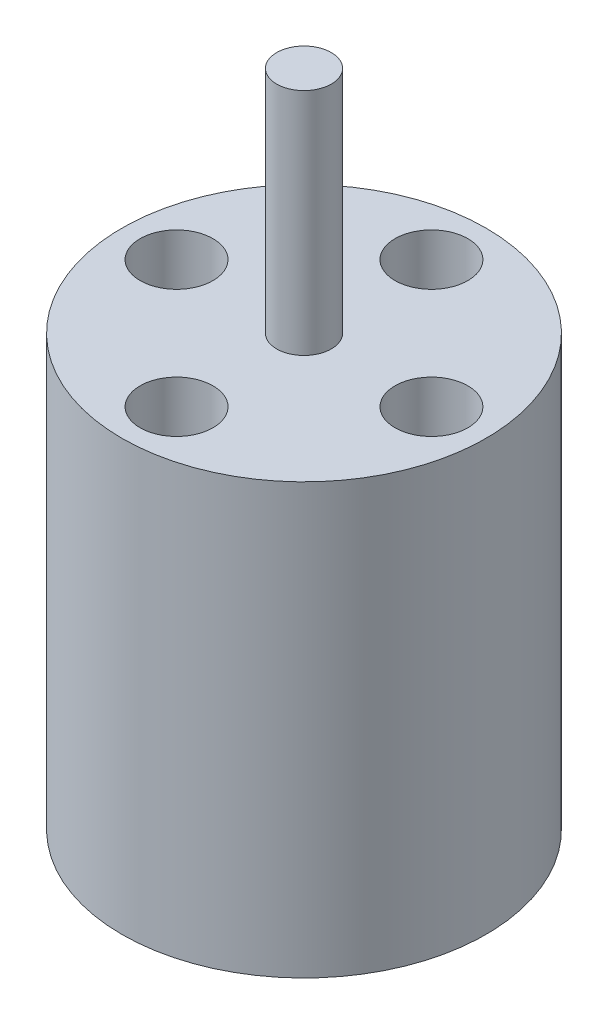
ISO-10303-21;
HEADER;
FILE_DESCRIPTION(('STEP AP214'),'2;1');
FILE_NAME('part.step','',(''),(''),'','','');
FILE_SCHEMA(('AUTOMOTIVE_DESIGN { 1 0 10303 214 1 1 1 1 }'));
ENDSEC;
DATA;
#1=APPLICATION_CONTEXT('core data for automotive mechanical design processes');
#2=APPLICATION_PROTOCOL_DEFINITION('international standard','automotive_design',2000,#1);
#3=PRODUCT_CONTEXT('',#1,'mechanical');
#4=PRODUCT('Part','Part','',(#3));
#5=PRODUCT_RELATED_PRODUCT_CATEGORY('part','',(#4));
#6=PRODUCT_DEFINITION_FORMATION('','',#4);
#7=PRODUCT_DEFINITION_CONTEXT('part definition',#1,'design');
#8=PRODUCT_DEFINITION('design','',#6,#7);
#9=PRODUCT_DEFINITION_SHAPE('','',#8);
#10=(LENGTH_UNIT() NAMED_UNIT(*) SI_UNIT(.MILLI.,.METRE.));
#11=(NAMED_UNIT(*) PLANE_ANGLE_UNIT() SI_UNIT($,.RADIAN.));
#12=(NAMED_UNIT(*) SI_UNIT($,.STERADIAN.) SOLID_ANGLE_UNIT());
#13=UNCERTAINTY_MEASURE_WITH_UNIT(LENGTH_MEASURE(1.E-05),#10,'distance_accuracy_value','');
#14=(GEOMETRIC_REPRESENTATION_CONTEXT(3) GLOBAL_UNCERTAINTY_ASSIGNED_CONTEXT((#13)) GLOBAL_UNIT_ASSIGNED_CONTEXT((#10,
#11,#12)) REPRESENTATION_CONTEXT('',''));
#15=CARTESIAN_POINT('',(0.,0.,0.));
#16=DIRECTION('',(0.,0.,1.));
#17=DIRECTION('',(1.,0.,0.));
#18=AXIS2_PLACEMENT_3D('',#15,#16,#17);
#19=CARTESIAN_POINT('',(-0.143044278026615,11.8,0.));
#20=DIRECTION('',(0.,-1.,0.));
#21=DIRECTION('',(0.,0.,-1.));
#22=AXIS2_PLACEMENT_3D('',#19,#20,#21);
#23=CYLINDRICAL_SURFACE('',#22,5.);
#24=CARTESIAN_POINT('',(-0.143044278026615,11.8,0.));
#25=DIRECTION('',(0.,1.,0.));
#26=DIRECTION('',(0.,0.,1.));
#27=AXIS2_PLACEMENT_3D('',#24,#25,#26);
#28=CIRCLE('',#27,5.);
#29=CARTESIAN_POINT('',(-0.143044278026615,11.8,5.));
#30=VERTEX_POINT('',#29);
#31=EDGE_CURVE('E51',#30,#30,#28,.T.);
#32=ORIENTED_EDGE('',*,*,#31,.F.);
#33=EDGE_LOOP('',(#32));
#34=FACE_BOUND('',#33,.T.);
#35=CARTESIAN_POINT('',(-0.143044278026615,0.,0.));
#36=DIRECTION('',(0.,1.,0.));
#37=DIRECTION('',(0.,0.,1.));
#38=AXIS2_PLACEMENT_3D('',#35,#36,#37);
#39=CIRCLE('',#38,5.);
#40=CARTESIAN_POINT('',(-0.143044278026615,0.,5.));
#41=VERTEX_POINT('',#40);
#42=EDGE_CURVE('E46',#41,#41,#39,.T.);
#43=ORIENTED_EDGE('',*,*,#42,.T.);
#44=EDGE_LOOP('',(#43));
#45=FACE_BOUND('',#44,.T.);
#46=ADVANCED_FACE('F43',(#34,#45),#23,.T.);
#47=CARTESIAN_POINT('',(-0.143044278026615,11.8,0.));
#48=DIRECTION('',(0.,1.,0.));
#49=DIRECTION('',(0.,0.,1.));
#50=AXIS2_PLACEMENT_3D('',#47,#48,#49);
#51=PLANE('',#50);
#52=CARTESIAN_POINT('',(-3.64304427802661,11.8,0.));
#53=DIRECTION('',(0.,1.,0.));
#54=DIRECTION('',(0.,0.,1.));
#55=AXIS2_PLACEMENT_3D('',#52,#53,#54);
#56=CIRCLE('',#55,1.);
#57=CARTESIAN_POINT('',(-3.64304427802661,11.8,1.));
#58=VERTEX_POINT('',#57);
#59=EDGE_CURVE('E87',#58,#58,#56,.T.);
#60=ORIENTED_EDGE('',*,*,#59,.F.);
#61=EDGE_LOOP('',(#60));
#62=FACE_BOUND('',#61,.T.);
#63=CARTESIAN_POINT('',(-0.143044278026612,11.8,3.5));
#64=DIRECTION('',(0.,1.,0.));
#65=DIRECTION('',(0.,0.,1.));
#66=AXIS2_PLACEMENT_3D('',#63,#64,#65);
#67=CIRCLE('',#66,1.);
#68=CARTESIAN_POINT('',(-0.143044278026612,11.8,4.5));
#69=VERTEX_POINT('',#68);
#70=EDGE_CURVE('E83',#69,#69,#67,.T.);
#71=ORIENTED_EDGE('',*,*,#70,.F.);
#72=EDGE_LOOP('',(#71));
#73=FACE_BOUND('',#72,.T.);
#74=CARTESIAN_POINT('',(-0.14304427802661,11.8,-3.5));
#75=DIRECTION('',(0.,1.,0.));
#76=DIRECTION('',(0.,0.,1.));
#77=AXIS2_PLACEMENT_3D('',#74,#75,#76);
#78=CIRCLE('',#77,1.00000000000001);
#79=CARTESIAN_POINT('',(-0.14304427802661,11.8,-2.49999999999999));
#80=VERTEX_POINT('',#79);
#81=EDGE_CURVE('E75',#80,#80,#78,.T.);
#82=ORIENTED_EDGE('',*,*,#81,.F.);
#83=EDGE_LOOP('',(#82));
#84=FACE_BOUND('',#83,.T.);
#85=CARTESIAN_POINT('',(3.35695572197339,11.8,0.));
#86=DIRECTION('',(0.,1.,0.));
#87=DIRECTION('',(0.,0.,1.));
#88=AXIS2_PLACEMENT_3D('',#85,#86,#87);
#89=CIRCLE('',#88,1.00000000000002);
#90=CARTESIAN_POINT('',(3.35695572197339,11.8,1.00000000000002));
#91=VERTEX_POINT('',#90);
#92=EDGE_CURVE('E67',#91,#91,#89,.T.);
#93=ORIENTED_EDGE('',*,*,#92,.F.);
#94=EDGE_LOOP('',(#93));
#95=FACE_BOUND('',#94,.T.);
#96=CARTESIAN_POINT('',(-0.143044278026615,11.8,0.));
#97=DIRECTION('',(0.,1.,0.));
#98=DIRECTION('',(0.,0.,1.));
#99=AXIS2_PLACEMENT_3D('',#96,#97,#98);
#100=CIRCLE('',#99,0.75);
#101=CARTESIAN_POINT('',(-0.143044278026615,11.8,0.75));
#102=VERTEX_POINT('',#101);
#103=EDGE_CURVE('E10',#102,#102,#100,.T.);
#104=ORIENTED_EDGE('',*,*,#103,.F.);
#105=EDGE_LOOP('',(#104));
#106=FACE_BOUND('',#105,.T.);
#107=ORIENTED_EDGE('',*,*,#31,.T.);
#108=EDGE_LOOP('',(#107));
#109=FACE_BOUND('',#108,.T.);
#110=ADVANCED_FACE('F104',(#62,#73,#84,#95,#106,#109),#51,.T.);
#111=CARTESIAN_POINT('',(-0.143044278026615,0.,0.));
#112=DIRECTION('',(0.,1.,0.));
#113=DIRECTION('',(0.,0.,1.));
#114=AXIS2_PLACEMENT_3D('',#111,#112,#113);
#115=PLANE('',#114);
#116=ORIENTED_EDGE('',*,*,#42,.F.);
#117=EDGE_LOOP('',(#116));
#118=FACE_BOUND('',#117,.T.);
#119=ADVANCED_FACE('F107',(#118),#115,.F.);
#120=CARTESIAN_POINT('',(-0.143044278026615,18.1,0.));
#121=DIRECTION('',(0.,-1.,0.));
#122=DIRECTION('',(0.,0.,-1.));
#123=AXIS2_PLACEMENT_3D('',#120,#121,#122);
#124=CYLINDRICAL_SURFACE('',#123,0.75);
#125=CARTESIAN_POINT('',(-0.143044278026615,18.1,0.));
#126=DIRECTION('',(0.,1.,0.));
#127=DIRECTION('',(0.,0.,1.));
#128=AXIS2_PLACEMENT_3D('',#125,#126,#127);
#129=CIRCLE('',#128,0.75);
#130=CARTESIAN_POINT('',(-0.143044278026615,18.1,0.75));
#131=VERTEX_POINT('',#130);
#132=EDGE_CURVE('E58',#131,#131,#129,.T.);
#133=ORIENTED_EDGE('',*,*,#132,.F.);
#134=EDGE_LOOP('',(#133));
#135=FACE_BOUND('',#134,.T.);
#136=ORIENTED_EDGE('',*,*,#103,.T.);
#137=EDGE_LOOP('',(#136));
#138=FACE_BOUND('',#137,.T.);
#139=ADVANCED_FACE('F125',(#135,#138),#124,.T.);
#140=CARTESIAN_POINT('',(-0.143044278026615,18.1,0.));
#141=DIRECTION('',(0.,1.,0.));
#142=DIRECTION('',(0.,0.,1.));
#143=AXIS2_PLACEMENT_3D('',#140,#141,#142);
#144=PLANE('',#143);
#145=ORIENTED_EDGE('',*,*,#132,.T.);
#146=EDGE_LOOP('',(#145));
#147=FACE_BOUND('',#146,.T.);
#148=ADVANCED_FACE('F129',(#147),#144,.T.);
#149=CARTESIAN_POINT('',(3.35695572197339,6.8,0.));
#150=DIRECTION('',(0.,1.,0.));
#151=DIRECTION('',(0.,0.,1.));
#152=AXIS2_PLACEMENT_3D('',#149,#150,#151);
#153=CYLINDRICAL_SURFACE('',#152,1.00000000000002);
#154=CARTESIAN_POINT('',(3.35695572197339,6.8,0.));
#155=DIRECTION('',(0.,1.,0.));
#156=DIRECTION('',(0.,0.,1.));
#157=AXIS2_PLACEMENT_3D('',#154,#155,#156);
#158=CIRCLE('',#157,1.00000000000002);
#159=CARTESIAN_POINT('',(3.35695572197339,6.8,1.00000000000002));
#160=VERTEX_POINT('',#159);
#161=EDGE_CURVE('E63',#160,#160,#158,.T.);
#162=ORIENTED_EDGE('',*,*,#161,.F.);
#163=EDGE_LOOP('',(#162));
#164=FACE_BOUND('',#163,.T.);
#165=ORIENTED_EDGE('',*,*,#92,.T.);
#166=EDGE_LOOP('',(#165));
#167=FACE_BOUND('',#166,.T.);
#168=ADVANCED_FACE('F135',(#164,#167),#153,.F.);
#169=CARTESIAN_POINT('',(3.35695572197339,6.8,0.));
#170=DIRECTION('',(0.,1.,0.));
#171=DIRECTION('',(0.,0.,1.));
#172=AXIS2_PLACEMENT_3D('',#169,#170,#171);
#173=PLANE('',#172);
#174=ORIENTED_EDGE('',*,*,#161,.T.);
#175=EDGE_LOOP('',(#174));
#176=FACE_BOUND('',#175,.T.);
#177=ADVANCED_FACE('F137',(#176),#173,.T.);
#178=CARTESIAN_POINT('',(-0.14304427802661,6.8,-3.5));
#179=DIRECTION('',(0.,1.,0.));
#180=DIRECTION('',(0.,0.,1.));
#181=AXIS2_PLACEMENT_3D('',#178,#179,#180);
#182=CYLINDRICAL_SURFACE('',#181,1.00000000000001);
#183=CARTESIAN_POINT('',(-0.14304427802661,6.8,-3.5));
#184=DIRECTION('',(0.,1.,0.));
#185=DIRECTION('',(0.,0.,1.));
#186=AXIS2_PLACEMENT_3D('',#183,#184,#185);
#187=CIRCLE('',#186,1.00000000000001);
#188=CARTESIAN_POINT('',(-0.14304427802661,6.8,-2.49999999999999));
#189=VERTEX_POINT('',#188);
#190=EDGE_CURVE('E71',#189,#189,#187,.T.);
#191=ORIENTED_EDGE('',*,*,#190,.F.);
#192=EDGE_LOOP('',(#191));
#193=FACE_BOUND('',#192,.T.);
#194=ORIENTED_EDGE('',*,*,#81,.T.);
#195=EDGE_LOOP('',(#194));
#196=FACE_BOUND('',#195,.T.);
#197=ADVANCED_FACE('F140',(#193,#196),#182,.F.);
#198=CARTESIAN_POINT('',(-0.14304427802661,6.8,-3.5));
#199=DIRECTION('',(0.,1.,0.));
#200=DIRECTION('',(0.,0.,1.));
#201=AXIS2_PLACEMENT_3D('',#198,#199,#200);
#202=PLANE('',#201);
#203=ORIENTED_EDGE('',*,*,#190,.T.);
#204=EDGE_LOOP('',(#203));
#205=FACE_BOUND('',#204,.T.);
#206=ADVANCED_FACE('F145',(#205),#202,.T.);
#207=CARTESIAN_POINT('',(-0.143044278026612,6.8,3.5));
#208=DIRECTION('',(0.,1.,0.));
#209=DIRECTION('',(0.,0.,1.));
#210=AXIS2_PLACEMENT_3D('',#207,#208,#209);
#211=CYLINDRICAL_SURFACE('',#210,1.);
#212=CARTESIAN_POINT('',(-0.143044278026612,6.8,3.5));
#213=DIRECTION('',(0.,1.,0.));
#214=DIRECTION('',(0.,0.,1.));
#215=AXIS2_PLACEMENT_3D('',#212,#213,#214);
#216=CIRCLE('',#215,1.);
#217=CARTESIAN_POINT('',(-0.143044278026612,6.8,4.5));
#218=VERTEX_POINT('',#217);
#219=EDGE_CURVE('E79',#218,#218,#216,.T.);
#220=ORIENTED_EDGE('',*,*,#219,.F.);
#221=EDGE_LOOP('',(#220));
#222=FACE_BOUND('',#221,.T.);
#223=ORIENTED_EDGE('',*,*,#70,.T.);
#224=EDGE_LOOP('',(#223));
#225=FACE_BOUND('',#224,.T.);
#226=ADVANCED_FACE('F148',(#222,#225),#211,.F.);
#227=CARTESIAN_POINT('',(-0.143044278026612,6.8,3.5));
#228=DIRECTION('',(0.,1.,0.));
#229=DIRECTION('',(0.,0.,1.));
#230=AXIS2_PLACEMENT_3D('',#227,#228,#229);
#231=PLANE('',#230);
#232=ORIENTED_EDGE('',*,*,#219,.T.);
#233=EDGE_LOOP('',(#232));
#234=FACE_BOUND('',#233,.T.);
#235=ADVANCED_FACE('F100',(#234),#231,.T.);
#236=CARTESIAN_POINT('',(-3.64304427802661,6.8,0.));
#237=DIRECTION('',(0.,1.,0.));
#238=DIRECTION('',(0.,0.,1.));
#239=AXIS2_PLACEMENT_3D('',#236,#237,#238);
#240=CYLINDRICAL_SURFACE('',#239,1.);
#241=CARTESIAN_POINT('',(-3.64304427802661,6.8,0.));
#242=DIRECTION('',(0.,1.,0.));
#243=DIRECTION('',(0.,0.,1.));
#244=AXIS2_PLACEMENT_3D('',#241,#242,#243);
#245=CIRCLE('',#244,1.);
#246=CARTESIAN_POINT('',(-3.64304427802661,6.8,1.));
#247=VERTEX_POINT('',#246);
#248=EDGE_CURVE('E62',#247,#247,#245,.T.);
#249=ORIENTED_EDGE('',*,*,#248,.F.);
#250=EDGE_LOOP('',(#249));
#251=FACE_BOUND('',#250,.T.);
#252=ORIENTED_EDGE('',*,*,#59,.T.);
#253=EDGE_LOOP('',(#252));
#254=FACE_BOUND('',#253,.T.);
#255=ADVANCED_FACE('F97',(#251,#254),#240,.F.);
#256=CARTESIAN_POINT('',(-3.64304427802661,6.8,0.));
#257=DIRECTION('',(0.,1.,0.));
#258=DIRECTION('',(0.,0.,1.));
#259=AXIS2_PLACEMENT_3D('',#256,#257,#258);
#260=PLANE('',#259);
#261=ORIENTED_EDGE('',*,*,#248,.T.);
#262=EDGE_LOOP('',(#261));
#263=FACE_BOUND('',#262,.T.);
#264=ADVANCED_FACE('F95',(#263),#260,.T.);
#265=CLOSED_SHELL('',(#46,#110,#119,#139,#148,#168,#177,#197,#206,#226,#235,#255,#264));
#266=MANIFOLD_SOLID_BREP('B2',#265);
#267=ADVANCED_BREP_SHAPE_REPRESENTATION('',(#18,#266),#14);
#268=SHAPE_DEFINITION_REPRESENTATION(#9,#267);
ENDSEC;
END-ISO-10303-21;
